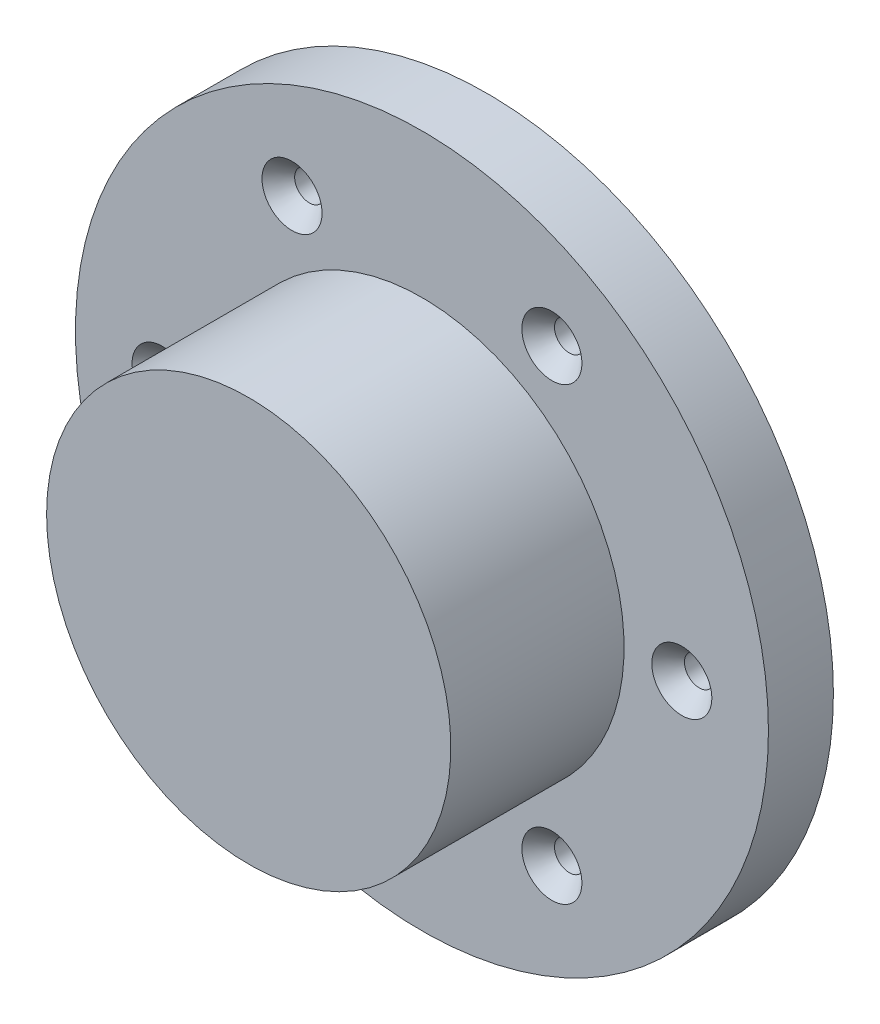
ISO-10303-21;
HEADER;
FILE_DESCRIPTION(('STEP AP214'),'2;1');
FILE_NAME('part.step','',(''),(''),'','','');
FILE_SCHEMA(('AUTOMOTIVE_DESIGN { 1 0 10303 214 1 1 1 1 }'));
ENDSEC;
DATA;
#1=APPLICATION_CONTEXT('core data for automotive mechanical design processes');
#2=APPLICATION_PROTOCOL_DEFINITION('international standard','automotive_design',2000,#1);
#3=PRODUCT_CONTEXT('',#1,'mechanical');
#4=PRODUCT('Part','Part','',(#3));
#5=PRODUCT_RELATED_PRODUCT_CATEGORY('part','',(#4));
#6=PRODUCT_DEFINITION_FORMATION('','',#4);
#7=PRODUCT_DEFINITION_CONTEXT('part definition',#1,'design');
#8=PRODUCT_DEFINITION('design','',#6,#7);
#9=PRODUCT_DEFINITION_SHAPE('','',#8);
#10=(LENGTH_UNIT() NAMED_UNIT(*) SI_UNIT(.MILLI.,.METRE.));
#11=(NAMED_UNIT(*) PLANE_ANGLE_UNIT() SI_UNIT($,.RADIAN.));
#12=(NAMED_UNIT(*) SI_UNIT($,.STERADIAN.) SOLID_ANGLE_UNIT());
#13=UNCERTAINTY_MEASURE_WITH_UNIT(LENGTH_MEASURE(1.E-05),#10,'distance_accuracy_value','');
#14=(GEOMETRIC_REPRESENTATION_CONTEXT(3) GLOBAL_UNCERTAINTY_ASSIGNED_CONTEXT((#13)) GLOBAL_UNIT_ASSIGNED_CONTEXT((#10,
#11,#12)) REPRESENTATION_CONTEXT('',''));
#15=CARTESIAN_POINT('',(0.,0.,0.));
#16=DIRECTION('',(0.,0.,1.));
#17=DIRECTION('',(1.,0.,0.));
#18=AXIS2_PLACEMENT_3D('',#15,#16,#17);
#19=CARTESIAN_POINT('',(0.,0.,26.19375));
#20=DIRECTION('',(0.,0.,-1.));
#21=DIRECTION('',(-1.,0.,0.));
#22=AXIS2_PLACEMENT_3D('',#19,#20,#21);
#23=CYLINDRICAL_SURFACE('',#22,22.225);
#24=CARTESIAN_POINT('',(0.,0.,26.19375));
#25=DIRECTION('',(0.,0.,1.));
#26=DIRECTION('',(1.,0.,0.));
#27=AXIS2_PLACEMENT_3D('',#24,#25,#26);
#28=CIRCLE('',#27,22.225);
#29=CARTESIAN_POINT('',(-22.225,0.,26.19375));
#30=VERTEX_POINT('',#29);
#31=EDGE_CURVE('E11',#30,#30,#28,.T.);
#32=CARTESIAN_POINT('',(0.,0.,7.14375));
#33=DIRECTION('',(0.,0.,1.));
#34=DIRECTION('',(1.,0.,0.));
#35=AXIS2_PLACEMENT_3D('',#32,#33,#34);
#36=CIRCLE('',#35,22.225);
#37=CARTESIAN_POINT('',(-22.225,0.,7.14375));
#38=VERTEX_POINT('',#37);
#39=EDGE_CURVE('E56',#38,#38,#36,.T.);
#40=CARTESIAN_POINT('',(-22.225,0.,26.19375));
#41=CARTESIAN_POINT('',(-22.225,0.,25.9953125));
#42=CARTESIAN_POINT('',(-22.225,0.,25.796875));
#43=CARTESIAN_POINT('',(-22.225,0.,25.4));
#44=CARTESIAN_POINT('',(-22.225,0.,25.2015625));
#45=CARTESIAN_POINT('',(-22.225,0.,24.8046875));
#46=CARTESIAN_POINT('',(-22.225,0.,24.60625));
#47=CARTESIAN_POINT('',(-22.225,0.,24.209375));
#48=CARTESIAN_POINT('',(-22.225,0.,24.0109375));
#49=CARTESIAN_POINT('',(-22.225,0.,23.6140625));
#50=CARTESIAN_POINT('',(-22.225,0.,23.415625));
#51=CARTESIAN_POINT('',(-22.225,0.,23.01875));
#52=CARTESIAN_POINT('',(-22.225,0.,22.8203125));
#53=CARTESIAN_POINT('',(-22.225,0.,22.4234375));
#54=CARTESIAN_POINT('',(-22.225,0.,22.225));
#55=CARTESIAN_POINT('',(-22.225,0.,21.828125));
#56=CARTESIAN_POINT('',(-22.225,0.,21.6296875));
#57=CARTESIAN_POINT('',(-22.225,0.,21.2328125));
#58=CARTESIAN_POINT('',(-22.225,0.,21.034375));
#59=CARTESIAN_POINT('',(-22.225,0.,20.6375));
#60=CARTESIAN_POINT('',(-22.225,0.,20.4390625));
#61=CARTESIAN_POINT('',(-22.225,0.,20.0421875));
#62=CARTESIAN_POINT('',(-22.225,0.,19.84375));
#63=CARTESIAN_POINT('',(-22.225,0.,19.446875));
#64=CARTESIAN_POINT('',(-22.225,0.,19.2484375));
#65=CARTESIAN_POINT('',(-22.225,0.,18.8515625));
#66=CARTESIAN_POINT('',(-22.225,0.,18.653125));
#67=CARTESIAN_POINT('',(-22.225,0.,18.25625));
#68=CARTESIAN_POINT('',(-22.225,0.,18.0578125));
#69=CARTESIAN_POINT('',(-22.225,0.,17.6609375));
#70=CARTESIAN_POINT('',(-22.225,0.,17.4625));
#71=CARTESIAN_POINT('',(-22.225,0.,17.065625));
#72=CARTESIAN_POINT('',(-22.225,0.,16.8671875));
#73=CARTESIAN_POINT('',(-22.225,0.,16.4703125));
#74=CARTESIAN_POINT('',(-22.225,0.,16.271875));
#75=CARTESIAN_POINT('',(-22.225,0.,15.875));
#76=CARTESIAN_POINT('',(-22.225,0.,15.6765625));
#77=CARTESIAN_POINT('',(-22.225,0.,15.2796875));
#78=CARTESIAN_POINT('',(-22.225,0.,15.08125));
#79=CARTESIAN_POINT('',(-22.225,0.,14.684375));
#80=CARTESIAN_POINT('',(-22.225,0.,14.4859375));
#81=CARTESIAN_POINT('',(-22.225,0.,14.0890625));
#82=CARTESIAN_POINT('',(-22.225,0.,13.890625));
#83=CARTESIAN_POINT('',(-22.225,0.,13.49375));
#84=CARTESIAN_POINT('',(-22.225,0.,13.2953125));
#85=CARTESIAN_POINT('',(-22.225,0.,12.8984375));
#86=CARTESIAN_POINT('',(-22.225,0.,12.7));
#87=CARTESIAN_POINT('',(-22.225,0.,12.303125));
#88=CARTESIAN_POINT('',(-22.225,0.,12.1046875));
#89=CARTESIAN_POINT('',(-22.225,0.,11.7078125));
#90=CARTESIAN_POINT('',(-22.225,0.,11.509375));
#91=CARTESIAN_POINT('',(-22.225,0.,11.1125));
#92=CARTESIAN_POINT('',(-22.225,0.,10.9140625));
#93=CARTESIAN_POINT('',(-22.225,0.,10.5171875));
#94=CARTESIAN_POINT('',(-22.225,0.,10.31875));
#95=CARTESIAN_POINT('',(-22.225,0.,9.921875));
#96=CARTESIAN_POINT('',(-22.225,0.,9.7234375));
#97=CARTESIAN_POINT('',(-22.225,0.,9.3265625));
#98=CARTESIAN_POINT('',(-22.225,0.,9.128125));
#99=CARTESIAN_POINT('',(-22.225,0.,8.73125));
#100=CARTESIAN_POINT('',(-22.225,0.,8.5328125));
#101=CARTESIAN_POINT('',(-22.225,0.,8.1359375));
#102=CARTESIAN_POINT('',(-22.225,0.,7.9375));
#103=CARTESIAN_POINT('',(-22.225,0.,7.540625));
#104=CARTESIAN_POINT('',(-22.225,0.,7.3421875));
#105=CARTESIAN_POINT('',(-22.225,0.,7.14375));
#106=B_SPLINE_CURVE_WITH_KNOTS('',3,(#40,#41,#42,#43,#44,#45,#46,#47,#48,#49,#50,#51,#52,#53,
#54,#55,#56,#57,#58,#59,#60,#61,#62,#63,#64,#65,#66,#67,#68,#69,#70,#71,#72,#73,#74,#75,#76,#77,
#78,#79,#80,#81,#82,#83,#84,#85,#86,#87,#88,#89,#90,#91,#92,#93,#94,#95,#96,#97,#98,#99,#100,
#101,#102,#103,#104,#105),.UNSPECIFIED.,.F.,.F.,(4,2,2,2,2,2,2,2,2,2,2,2,2,2,2,2,2,2,2,2,2,2,2,
2,2,2,2,2,2,2,2,2,4),(0.,0.595312499999997,1.190625,1.7859375,2.38125,2.9765625,3.571875,
4.1671875,4.7625,5.3578125,5.953125,6.5484375,7.14375,7.7390625,8.33437499999999,
8.92968749999999,9.525,10.1203125,10.715625,11.3109375,11.90625,12.5015625,13.096875,13.6921875,
14.2875,14.8828125,15.478125,16.0734375,16.66875,17.2640625,17.859375,18.4546875,19.05),.UNSPECIFIED.);
#107=EDGE_CURVE('BSEAM53',#30,#38,#106,.T.);
#108=ORIENTED_EDGE('',*,*,#31,.F.);
#109=ORIENTED_EDGE('',*,*,#39,.T.);
#110=ORIENTED_EDGE('',*,*,#107,.T.);
#111=ORIENTED_EDGE('',*,*,#107,.F.);
#112=EDGE_LOOP('',(#108,#110,#109,#111));
#113=FACE_BOUND('',#112,.T.);
#114=ADVANCED_FACE('F53',(#113),#23,.T.);
#115=CARTESIAN_POINT('',(0.,0.,26.19375));
#116=DIRECTION('',(0.,0.,1.));
#117=DIRECTION('',(1.,0.,0.));
#118=AXIS2_PLACEMENT_3D('',#115,#116,#117);
#119=PLANE('',#118);
#120=ORIENTED_EDGE('',*,*,#31,.T.);
#121=EDGE_LOOP('',(#120));
#122=FACE_BOUND('',#121,.T.);
#123=ADVANCED_FACE('F70',(#122),#119,.T.);
#124=CARTESIAN_POINT('',(0.,0.,7.14375));
#125=DIRECTION('',(0.,0.,1.));
#126=DIRECTION('',(1.,0.,0.));
#127=AXIS2_PLACEMENT_3D('',#124,#125,#126);
#128=PLANE('',#127);
#129=ORIENTED_EDGE('',*,*,#39,.F.);
#130=EDGE_LOOP('',(#129));
#131=FACE_BOUND('',#130,.T.);
#132=ADVANCED_FACE('F68',(#131),#128,.F.);
#133=CLOSED_SHELL('',(#114,#123,#132));
#134=MANIFOLD_SOLID_BREP('B2',#133);
#135=CARTESIAN_POINT('',(0.,0.,7.14375));
#136=DIRECTION('',(0.,0.,-1.));
#137=DIRECTION('',(-1.,0.,0.));
#138=AXIS2_PLACEMENT_3D('',#135,#136,#137);
#139=CYLINDRICAL_SURFACE('',#138,38.1);
#140=CARTESIAN_POINT('',(0.,0.,7.14375));
#141=DIRECTION('',(0.,0.,1.));
#142=DIRECTION('',(1.,0.,0.));
#143=AXIS2_PLACEMENT_3D('',#140,#141,#142);
#144=CIRCLE('',#143,38.1);
#145=CARTESIAN_POINT('',(38.1,0.,7.14375));
#146=VERTEX_POINT('',#145);
#147=EDGE_CURVE('E52',#146,#146,#144,.T.);
#148=ORIENTED_EDGE('',*,*,#147,.F.);
#149=EDGE_LOOP('',(#148));
#150=FACE_BOUND('',#149,.T.);
#151=CARTESIAN_POINT('',(0.,0.,0.));
#152=DIRECTION('',(0.,0.,1.));
#153=DIRECTION('',(1.,0.,0.));
#154=AXIS2_PLACEMENT_3D('',#151,#152,#153);
#155=CIRCLE('',#154,38.1);
#156=CARTESIAN_POINT('',(38.1,0.,0.));
#157=VERTEX_POINT('',#156);
#158=EDGE_CURVE('E99',#157,#157,#155,.T.);
#159=ORIENTED_EDGE('',*,*,#158,.T.);
#160=EDGE_LOOP('',(#159));
#161=FACE_BOUND('',#160,.T.);
#162=ADVANCED_FACE('F96',(#150,#161),#139,.T.);
#163=CARTESIAN_POINT('',(0.,0.,7.14375));
#164=DIRECTION('',(0.,0.,1.));
#165=DIRECTION('',(1.,0.,0.));
#166=AXIS2_PLACEMENT_3D('',#163,#164,#165);
#167=PLANE('',#166);
#168=CARTESIAN_POINT('',(0.,0.,7.14375));
#169=DIRECTION('',(0.,0.,-1.));
#170=DIRECTION('',(-1.,0.,0.));
#171=AXIS2_PLACEMENT_3D('',#168,#169,#170);
#172=CIRCLE('',#171,17.4625);
#173=CARTESIAN_POINT('',(-17.4625,0.,7.14375));
#174=VERTEX_POINT('',#173);
#175=EDGE_CURVE('E161',#174,#174,#172,.T.);
#176=ORIENTED_EDGE('',*,*,#175,.T.);
#177=EDGE_LOOP('',(#176));
#178=FACE_BOUND('',#177,.T.);
#179=CARTESIAN_POINT('',(-28.575,-1.99538158514885E-13,7.14375));
#180=DIRECTION('',(0.,0.,1.));
#181=DIRECTION('',(1.,0.,0.));
#182=AXIS2_PLACEMENT_3D('',#179,#180,#181);
#183=CIRCLE('',#182,3.302);
#184=CARTESIAN_POINT('',(-25.273,-1.99538158514885E-13,7.14375));
#185=VERTEX_POINT('',#184);
#186=EDGE_CURVE('E158',#185,#185,#183,.T.);
#187=ORIENTED_EDGE('',*,*,#186,.F.);
#188=EDGE_LOOP('',(#187));
#189=FACE_BOUND('',#188,.T.);
#190=CARTESIAN_POINT('',(-14.2875000000001,24.7466759131403,7.14375));
#191=DIRECTION('',(0.,0.,1.));
#192=DIRECTION('',(1.,0.,0.));
#193=AXIS2_PLACEMENT_3D('',#190,#191,#192);
#194=CIRCLE('',#193,3.302);
#195=CARTESIAN_POINT('',(-10.9855000000001,24.7466759131403,7.14375));
#196=VERTEX_POINT('',#195);
#197=EDGE_CURVE('E149',#196,#196,#194,.T.);
#198=ORIENTED_EDGE('',*,*,#197,.F.);
#199=EDGE_LOOP('',(#198));
#200=FACE_BOUND('',#199,.T.);
#201=CARTESIAN_POINT('',(14.2874999999999,24.7466759131404,7.14375));
#202=DIRECTION('',(0.,0.,1.));
#203=DIRECTION('',(1.,0.,0.));
#204=AXIS2_PLACEMENT_3D('',#201,#202,#203);
#205=CIRCLE('',#204,3.302);
#206=CARTESIAN_POINT('',(17.5894999999999,24.7466759131404,7.14375));
#207=VERTEX_POINT('',#206);
#208=EDGE_CURVE('E140',#207,#207,#205,.T.);
#209=ORIENTED_EDGE('',*,*,#208,.F.);
#210=EDGE_LOOP('',(#209));
#211=FACE_BOUND('',#210,.T.);
#212=CARTESIAN_POINT('',(28.575,0.,7.14375));
#213=DIRECTION('',(0.,0.,1.));
#214=DIRECTION('',(1.,0.,0.));
#215=AXIS2_PLACEMENT_3D('',#212,#213,#214);
#216=CIRCLE('',#215,3.302);
#217=CARTESIAN_POINT('',(31.877,0.,7.14375));
#218=VERTEX_POINT('',#217);
#219=EDGE_CURVE('E131',#218,#218,#216,.T.);
#220=ORIENTED_EDGE('',*,*,#219,.F.);
#221=EDGE_LOOP('',(#220));
#222=FACE_BOUND('',#221,.T.);
#223=CARTESIAN_POINT('',(14.2875000000003,-24.7466759131402,7.14375));
#224=DIRECTION('',(0.,0.,1.));
#225=DIRECTION('',(1.,0.,0.));
#226=AXIS2_PLACEMENT_3D('',#223,#224,#225);
#227=CIRCLE('',#226,3.302);
#228=CARTESIAN_POINT('',(17.5895000000003,-24.7466759131402,7.14375));
#229=VERTEX_POINT('',#228);
#230=EDGE_CURVE('E122',#229,#229,#227,.T.);
#231=ORIENTED_EDGE('',*,*,#230,.F.);
#232=EDGE_LOOP('',(#231));
#233=FACE_BOUND('',#232,.T.);
#234=CARTESIAN_POINT('',(-14.2874999999998,-24.7466759131405,7.14375));
#235=DIRECTION('',(0.,0.,1.));
#236=DIRECTION('',(1.,0.,0.));
#237=AXIS2_PLACEMENT_3D('',#234,#235,#236);
#238=CIRCLE('',#237,3.302);
#239=CARTESIAN_POINT('',(-10.9854999999998,-24.7466759131405,7.14375));
#240=VERTEX_POINT('',#239);
#241=EDGE_CURVE('E113',#240,#240,#238,.T.);
#242=ORIENTED_EDGE('',*,*,#241,.F.);
#243=EDGE_LOOP('',(#242));
#244=FACE_BOUND('',#243,.T.);
#245=ORIENTED_EDGE('',*,*,#147,.T.);
#246=EDGE_LOOP('',(#245));
#247=FACE_BOUND('',#246,.T.);
#248=ADVANCED_FACE('F168',(#178,#189,#200,#211,#222,#233,#244,#247),#167,.T.);
#249=CARTESIAN_POINT('',(0.,0.,0.));
#250=DIRECTION('',(0.,0.,1.));
#251=DIRECTION('',(1.,0.,0.));
#252=AXIS2_PLACEMENT_3D('',#249,#250,#251);
#253=PLANE('',#252);
#254=CARTESIAN_POINT('',(0.,0.,0.));
#255=DIRECTION('',(0.,0.,-1.));
#256=DIRECTION('',(-1.,0.,0.));
#257=AXIS2_PLACEMENT_3D('',#254,#255,#256);
#258=CIRCLE('',#257,17.4625);
#259=CARTESIAN_POINT('',(-17.4625,0.,0.));
#260=VERTEX_POINT('',#259);
#261=EDGE_CURVE('E162',#260,#260,#258,.T.);
#262=ORIENTED_EDGE('',*,*,#261,.F.);
#263=EDGE_LOOP('',(#262));
#264=FACE_BOUND('',#263,.T.);
#265=CARTESIAN_POINT('',(-28.575,-1.99538158514885E-13,0.));
#266=DIRECTION('',(0.,0.,1.));
#267=DIRECTION('',(1.,0.,0.));
#268=AXIS2_PLACEMENT_3D('',#265,#266,#267);
#269=CIRCLE('',#268,1.63195);
#270=CARTESIAN_POINT('',(-26.94305,-1.99538158514885E-13,0.));
#271=VERTEX_POINT('',#270);
#272=EDGE_CURVE('E152',#271,#271,#269,.T.);
#273=ORIENTED_EDGE('',*,*,#272,.T.);
#274=EDGE_LOOP('',(#273));
#275=FACE_BOUND('',#274,.T.);
#276=CARTESIAN_POINT('',(-14.2875000000001,24.7466759131403,0.));
#277=DIRECTION('',(0.,0.,1.));
#278=DIRECTION('',(1.,0.,0.));
#279=AXIS2_PLACEMENT_3D('',#276,#277,#278);
#280=CIRCLE('',#279,1.63195);
#281=CARTESIAN_POINT('',(-12.6555500000001,24.7466759131403,0.));
#282=VERTEX_POINT('',#281);
#283=EDGE_CURVE('E143',#282,#282,#280,.T.);
#284=ORIENTED_EDGE('',*,*,#283,.T.);
#285=EDGE_LOOP('',(#284));
#286=FACE_BOUND('',#285,.T.);
#287=CARTESIAN_POINT('',(14.2874999999999,24.7466759131404,0.));
#288=DIRECTION('',(0.,0.,1.));
#289=DIRECTION('',(1.,0.,0.));
#290=AXIS2_PLACEMENT_3D('',#287,#288,#289);
#291=CIRCLE('',#290,1.63195);
#292=CARTESIAN_POINT('',(15.9194499999999,24.7466759131404,0.));
#293=VERTEX_POINT('',#292);
#294=EDGE_CURVE('E134',#293,#293,#291,.T.);
#295=ORIENTED_EDGE('',*,*,#294,.T.);
#296=EDGE_LOOP('',(#295));
#297=FACE_BOUND('',#296,.T.);
#298=CARTESIAN_POINT('',(28.575,0.,0.));
#299=DIRECTION('',(0.,0.,1.));
#300=DIRECTION('',(1.,0.,0.));
#301=AXIS2_PLACEMENT_3D('',#298,#299,#300);
#302=CIRCLE('',#301,1.63195);
#303=CARTESIAN_POINT('',(30.20695,0.,0.));
#304=VERTEX_POINT('',#303);
#305=EDGE_CURVE('E125',#304,#304,#302,.T.);
#306=ORIENTED_EDGE('',*,*,#305,.T.);
#307=EDGE_LOOP('',(#306));
#308=FACE_BOUND('',#307,.T.);
#309=CARTESIAN_POINT('',(14.2875000000003,-24.7466759131402,0.));
#310=DIRECTION('',(0.,0.,1.));
#311=DIRECTION('',(1.,0.,0.));
#312=AXIS2_PLACEMENT_3D('',#309,#310,#311);
#313=CIRCLE('',#312,1.63195);
#314=CARTESIAN_POINT('',(15.9194500000003,-24.7466759131402,0.));
#315=VERTEX_POINT('',#314);
#316=EDGE_CURVE('E116',#315,#315,#313,.T.);
#317=ORIENTED_EDGE('',*,*,#316,.T.);
#318=EDGE_LOOP('',(#317));
#319=FACE_BOUND('',#318,.T.);
#320=CARTESIAN_POINT('',(-14.2874999999998,-24.7466759131405,0.));
#321=DIRECTION('',(0.,0.,1.));
#322=DIRECTION('',(1.,0.,0.));
#323=AXIS2_PLACEMENT_3D('',#320,#321,#322);
#324=CIRCLE('',#323,1.63195);
#325=CARTESIAN_POINT('',(-12.6555499999998,-24.7466759131405,0.));
#326=VERTEX_POINT('',#325);
#327=EDGE_CURVE('E106',#326,#326,#324,.T.);
#328=ORIENTED_EDGE('',*,*,#327,.T.);
#329=EDGE_LOOP('',(#328));
#330=FACE_BOUND('',#329,.T.);
#331=ORIENTED_EDGE('',*,*,#158,.F.);
#332=EDGE_LOOP('',(#331));
#333=FACE_BOUND('',#332,.T.);
#334=ADVANCED_FACE('F178',(#264,#275,#286,#297,#308,#319,#330,#333),#253,.F.);
#335=CARTESIAN_POINT('',(-14.2874999999998,-24.7466759131405,7.14375));
#336=DIRECTION('',(0.,0.,1.));
#337=DIRECTION('',(1.,0.,0.));
#338=AXIS2_PLACEMENT_3D('',#335,#336,#337);
#339=CYLINDRICAL_SURFACE('',#338,1.63195);
#340=ORIENTED_EDGE('',*,*,#327,.F.);
#341=EDGE_LOOP('',(#340));
#342=FACE_BOUND('',#341,.T.);
#343=CARTESIAN_POINT('',(-14.2874999999998,-24.7466759131405,5.22257724152055));
#344=DIRECTION('',(0.,0.,1.));
#345=DIRECTION('',(1.,0.,0.));
#346=AXIS2_PLACEMENT_3D('',#343,#344,#345);
#347=CIRCLE('',#346,1.63195);
#348=CARTESIAN_POINT('',(-12.6555499999998,-24.7466759131405,5.22257724152055));
#349=VERTEX_POINT('',#348);
#350=EDGE_CURVE('E110',#349,#349,#347,.T.);
#351=ORIENTED_EDGE('',*,*,#350,.T.);
#352=EDGE_LOOP('',(#351));
#353=FACE_BOUND('',#352,.T.);
#354=ADVANCED_FACE('F181',(#342,#353),#339,.F.);
#355=CARTESIAN_POINT('',(-14.2874999999998,-24.7466759131405,7.14375));
#356=DIRECTION('',(0.,0.,1.));
#357=DIRECTION('',(1.,0.,0.));
#358=AXIS2_PLACEMENT_3D('',#355,#356,#357);
#359=CONICAL_SURFACE('',#358,3.302,0.715584993317675);
#360=ORIENTED_EDGE('',*,*,#350,.F.);
#361=EDGE_LOOP('',(#360));
#362=FACE_BOUND('',#361,.T.);
#363=ORIENTED_EDGE('',*,*,#241,.T.);
#364=EDGE_LOOP('',(#363));
#365=FACE_BOUND('',#364,.T.);
#366=ADVANCED_FACE('F208',(#362,#365),#359,.F.);
#367=CARTESIAN_POINT('',(14.2875000000003,-24.7466759131402,7.14375));
#368=DIRECTION('',(0.,0.,1.));
#369=DIRECTION('',(1.,0.,0.));
#370=AXIS2_PLACEMENT_3D('',#367,#368,#369);
#371=CYLINDRICAL_SURFACE('',#370,1.63195);
#372=ORIENTED_EDGE('',*,*,#316,.F.);
#373=EDGE_LOOP('',(#372));
#374=FACE_BOUND('',#373,.T.);
#375=CARTESIAN_POINT('',(14.2875000000003,-24.7466759131402,5.22257724152055));
#376=DIRECTION('',(0.,0.,1.));
#377=DIRECTION('',(1.,0.,0.));
#378=AXIS2_PLACEMENT_3D('',#375,#376,#377);
#379=CIRCLE('',#378,1.63195);
#380=CARTESIAN_POINT('',(15.9194500000003,-24.7466759131402,5.22257724152055));
#381=VERTEX_POINT('',#380);
#382=EDGE_CURVE('E119',#381,#381,#379,.T.);
#383=ORIENTED_EDGE('',*,*,#382,.T.);
#384=EDGE_LOOP('',(#383));
#385=FACE_BOUND('',#384,.T.);
#386=ADVANCED_FACE('F212',(#374,#385),#371,.F.);
#387=CARTESIAN_POINT('',(14.2875000000003,-24.7466759131402,7.14375));
#388=DIRECTION('',(0.,0.,1.));
#389=DIRECTION('',(1.,0.,0.));
#390=AXIS2_PLACEMENT_3D('',#387,#388,#389);
#391=CONICAL_SURFACE('',#390,3.302,0.715584993317676);
#392=ORIENTED_EDGE('',*,*,#382,.F.);
#393=EDGE_LOOP('',(#392));
#394=FACE_BOUND('',#393,.T.);
#395=ORIENTED_EDGE('',*,*,#230,.T.);
#396=EDGE_LOOP('',(#395));
#397=FACE_BOUND('',#396,.T.);
#398=ADVANCED_FACE('F216',(#394,#397),#391,.F.);
#399=CARTESIAN_POINT('',(28.575,0.,7.14375));
#400=DIRECTION('',(0.,0.,1.));
#401=DIRECTION('',(1.,0.,0.));
#402=AXIS2_PLACEMENT_3D('',#399,#400,#401);
#403=CYLINDRICAL_SURFACE('',#402,1.63195);
#404=ORIENTED_EDGE('',*,*,#305,.F.);
#405=EDGE_LOOP('',(#404));
#406=FACE_BOUND('',#405,.T.);
#407=CARTESIAN_POINT('',(28.575,0.,5.22257724152055));
#408=DIRECTION('',(0.,0.,1.));
#409=DIRECTION('',(1.,0.,0.));
#410=AXIS2_PLACEMENT_3D('',#407,#408,#409);
#411=CIRCLE('',#410,1.63195);
#412=CARTESIAN_POINT('',(30.20695,0.,5.22257724152055));
#413=VERTEX_POINT('',#412);
#414=EDGE_CURVE('E128',#413,#413,#411,.T.);
#415=ORIENTED_EDGE('',*,*,#414,.T.);
#416=EDGE_LOOP('',(#415));
#417=FACE_BOUND('',#416,.T.);
#418=ADVANCED_FACE('F220',(#406,#417),#403,.F.);
#419=CARTESIAN_POINT('',(28.575,0.,7.14375));
#420=DIRECTION('',(0.,0.,1.));
#421=DIRECTION('',(1.,0.,0.));
#422=AXIS2_PLACEMENT_3D('',#419,#420,#421);
#423=CONICAL_SURFACE('',#422,3.302,0.715584993317675);
#424=ORIENTED_EDGE('',*,*,#414,.F.);
#425=EDGE_LOOP('',(#424));
#426=FACE_BOUND('',#425,.T.);
#427=ORIENTED_EDGE('',*,*,#219,.T.);
#428=EDGE_LOOP('',(#427));
#429=FACE_BOUND('',#428,.T.);
#430=ADVANCED_FACE('F224',(#426,#429),#423,.F.);
#431=CARTESIAN_POINT('',(14.2874999999999,24.7466759131404,7.14375));
#432=DIRECTION('',(0.,0.,1.));
#433=DIRECTION('',(1.,0.,0.));
#434=AXIS2_PLACEMENT_3D('',#431,#432,#433);
#435=CYLINDRICAL_SURFACE('',#434,1.63195);
#436=ORIENTED_EDGE('',*,*,#294,.F.);
#437=EDGE_LOOP('',(#436));
#438=FACE_BOUND('',#437,.T.);
#439=CARTESIAN_POINT('',(14.2874999999999,24.7466759131404,5.22257724152055));
#440=DIRECTION('',(0.,0.,1.));
#441=DIRECTION('',(1.,0.,0.));
#442=AXIS2_PLACEMENT_3D('',#439,#440,#441);
#443=CIRCLE('',#442,1.63195);
#444=CARTESIAN_POINT('',(15.9194499999999,24.7466759131404,5.22257724152055));
#445=VERTEX_POINT('',#444);
#446=EDGE_CURVE('E137',#445,#445,#443,.T.);
#447=ORIENTED_EDGE('',*,*,#446,.T.);
#448=EDGE_LOOP('',(#447));
#449=FACE_BOUND('',#448,.T.);
#450=ADVANCED_FACE('F228',(#438,#449),#435,.F.);
#451=CARTESIAN_POINT('',(14.2874999999999,24.7466759131404,7.14375));
#452=DIRECTION('',(0.,0.,1.));
#453=DIRECTION('',(1.,0.,0.));
#454=AXIS2_PLACEMENT_3D('',#451,#452,#453);
#455=CONICAL_SURFACE('',#454,3.302,0.715584993317675);
#456=ORIENTED_EDGE('',*,*,#446,.F.);
#457=EDGE_LOOP('',(#456));
#458=FACE_BOUND('',#457,.T.);
#459=ORIENTED_EDGE('',*,*,#208,.T.);
#460=EDGE_LOOP('',(#459));
#461=FACE_BOUND('',#460,.T.);
#462=ADVANCED_FACE('F232',(#458,#461),#455,.F.);
#463=CARTESIAN_POINT('',(-14.2875000000001,24.7466759131403,7.14375));
#464=DIRECTION('',(0.,0.,1.));
#465=DIRECTION('',(1.,0.,0.));
#466=AXIS2_PLACEMENT_3D('',#463,#464,#465);
#467=CYLINDRICAL_SURFACE('',#466,1.63195);
#468=ORIENTED_EDGE('',*,*,#283,.F.);
#469=EDGE_LOOP('',(#468));
#470=FACE_BOUND('',#469,.T.);
#471=CARTESIAN_POINT('',(-14.2875000000001,24.7466759131403,5.22257724152055));
#472=DIRECTION('',(0.,0.,1.));
#473=DIRECTION('',(1.,0.,0.));
#474=AXIS2_PLACEMENT_3D('',#471,#472,#473);
#475=CIRCLE('',#474,1.63195);
#476=CARTESIAN_POINT('',(-12.6555500000001,24.7466759131403,5.22257724152055));
#477=VERTEX_POINT('',#476);
#478=EDGE_CURVE('E146',#477,#477,#475,.T.);
#479=ORIENTED_EDGE('',*,*,#478,.T.);
#480=EDGE_LOOP('',(#479));
#481=FACE_BOUND('',#480,.T.);
#482=ADVANCED_FACE('F236',(#470,#481),#467,.F.);
#483=CARTESIAN_POINT('',(-14.2875000000001,24.7466759131403,7.14375));
#484=DIRECTION('',(0.,0.,1.));
#485=DIRECTION('',(1.,0.,0.));
#486=AXIS2_PLACEMENT_3D('',#483,#484,#485);
#487=CONICAL_SURFACE('',#486,3.302,0.715584993317675);
#488=ORIENTED_EDGE('',*,*,#478,.F.);
#489=EDGE_LOOP('',(#488));
#490=FACE_BOUND('',#489,.T.);
#491=ORIENTED_EDGE('',*,*,#197,.T.);
#492=EDGE_LOOP('',(#491));
#493=FACE_BOUND('',#492,.T.);
#494=ADVANCED_FACE('F240',(#490,#493),#487,.F.);
#495=CARTESIAN_POINT('',(-28.575,-1.99538158514885E-13,7.14375));
#496=DIRECTION('',(0.,0.,1.));
#497=DIRECTION('',(1.,0.,0.));
#498=AXIS2_PLACEMENT_3D('',#495,#496,#497);
#499=CYLINDRICAL_SURFACE('',#498,1.63195);
#500=ORIENTED_EDGE('',*,*,#272,.F.);
#501=EDGE_LOOP('',(#500));
#502=FACE_BOUND('',#501,.T.);
#503=CARTESIAN_POINT('',(-28.575,-1.99538158514885E-13,5.22257724152055));
#504=DIRECTION('',(0.,0.,1.));
#505=DIRECTION('',(1.,0.,0.));
#506=AXIS2_PLACEMENT_3D('',#503,#504,#505);
#507=CIRCLE('',#506,1.63195);
#508=CARTESIAN_POINT('',(-26.94305,-1.99538158514885E-13,5.22257724152055));
#509=VERTEX_POINT('',#508);
#510=EDGE_CURVE('E155',#509,#509,#507,.T.);
#511=ORIENTED_EDGE('',*,*,#510,.T.);
#512=EDGE_LOOP('',(#511));
#513=FACE_BOUND('',#512,.T.);
#514=ADVANCED_FACE('F244',(#502,#513),#499,.F.);
#515=CARTESIAN_POINT('',(-28.575,-1.99538158514885E-13,7.14375));
#516=DIRECTION('',(0.,0.,1.));
#517=DIRECTION('',(1.,0.,0.));
#518=AXIS2_PLACEMENT_3D('',#515,#516,#517);
#519=CONICAL_SURFACE('',#518,3.302,0.715584993317675);
#520=ORIENTED_EDGE('',*,*,#510,.F.);
#521=EDGE_LOOP('',(#520));
#522=FACE_BOUND('',#521,.T.);
#523=ORIENTED_EDGE('',*,*,#186,.T.);
#524=EDGE_LOOP('',(#523));
#525=FACE_BOUND('',#524,.T.);
#526=ADVANCED_FACE('F174',(#522,#525),#519,.F.);
#527=CARTESIAN_POINT('',(0.,0.,7.14375));
#528=DIRECTION('',(0.,0.,-1.));
#529=DIRECTION('',(-1.,0.,0.));
#530=AXIS2_PLACEMENT_3D('',#527,#528,#529);
#531=CYLINDRICAL_SURFACE('',#530,17.4625);
#532=ORIENTED_EDGE('',*,*,#175,.F.);
#533=EDGE_LOOP('',(#532));
#534=FACE_BOUND('',#533,.T.);
#535=ORIENTED_EDGE('',*,*,#261,.T.);
#536=EDGE_LOOP('',(#535));
#537=FACE_BOUND('',#536,.T.);
#538=ADVANCED_FACE('F171',(#534,#537),#531,.F.);
#539=CLOSED_SHELL('',(#162,#248,#334,#354,#366,#386,#398,#418,#430,#450,#462,#482,#494,#514,
#526,#538));
#540=MANIFOLD_SOLID_BREP('B6',#539);
#541=ADVANCED_BREP_SHAPE_REPRESENTATION('',(#18,#134,#540),#14);
#542=SHAPE_DEFINITION_REPRESENTATION(#9,#541);
ENDSEC;
END-ISO-10303-21;
